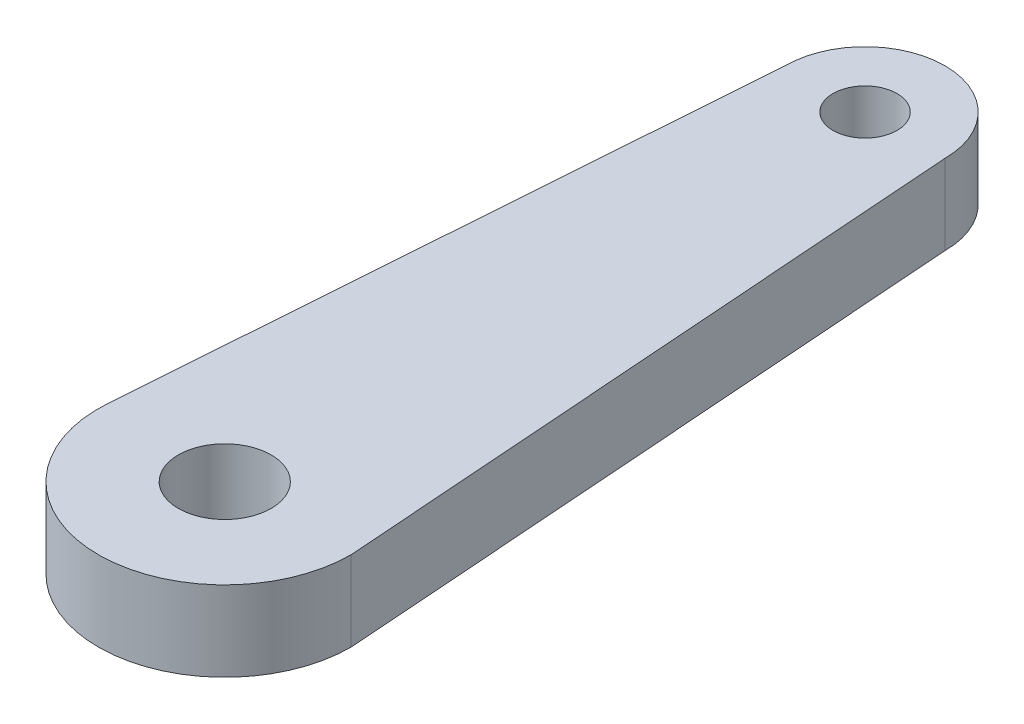
ISO-10303-21;
HEADER;
FILE_DESCRIPTION(('STEP AP214'),'2;1');
FILE_NAME('part.step','',(''),(''),'','','');
FILE_SCHEMA(('AUTOMOTIVE_DESIGN { 1 0 10303 214 1 1 1 1 }'));
ENDSEC;
DATA;
#1=APPLICATION_CONTEXT('core data for automotive mechanical design processes');
#2=APPLICATION_PROTOCOL_DEFINITION('international standard','automotive_design',2000,#1);
#3=PRODUCT_CONTEXT('',#1,'mechanical');
#4=PRODUCT('Part','Part','',(#3));
#5=PRODUCT_RELATED_PRODUCT_CATEGORY('part','',(#4));
#6=PRODUCT_DEFINITION_FORMATION('','',#4);
#7=PRODUCT_DEFINITION_CONTEXT('part definition',#1,'design');
#8=PRODUCT_DEFINITION('design','',#6,#7);
#9=PRODUCT_DEFINITION_SHAPE('','',#8);
#10=(LENGTH_UNIT() NAMED_UNIT(*) SI_UNIT(.MILLI.,.METRE.));
#11=(NAMED_UNIT(*) PLANE_ANGLE_UNIT() SI_UNIT($,.RADIAN.));
#12=(NAMED_UNIT(*) SI_UNIT($,.STERADIAN.) SOLID_ANGLE_UNIT());
#13=UNCERTAINTY_MEASURE_WITH_UNIT(LENGTH_MEASURE(1.E-05),#10,'distance_accuracy_value','');
#14=(GEOMETRIC_REPRESENTATION_CONTEXT(3) GLOBAL_UNCERTAINTY_ASSIGNED_CONTEXT((#13)) GLOBAL_UNIT_ASSIGNED_CONTEXT((#10,
#11,#12)) REPRESENTATION_CONTEXT('',''));
#15=CARTESIAN_POINT('',(0.,0.,0.));
#16=DIRECTION('',(0.,0.,1.));
#17=DIRECTION('',(1.,0.,0.));
#18=AXIS2_PLACEMENT_3D('',#15,#16,#17);
#19=CARTESIAN_POINT('',(7.85869274625251,5.,-0.569755224103307));
#20=DIRECTION('',(0.997382190387842,0.,-0.0723102088031186));
#21=DIRECTION('',(-0.0723102088031186,0.,-0.997382190387842));
#22=AXIS2_PLACEMENT_3D('',#19,#20,#21);
#23=PLANE('',#22);
#24=DIRECTION('',(0.0723102088031186,0.,0.997382190387842));
#25=VECTOR('',#24,1.);
#26=CARTESIAN_POINT('',(7.85869274625251,0.,-0.569755224103307));
#27=LINE('',#26,#25);
#28=CARTESIAN_POINT('',(5.,0.,-40.));
#29=VERTEX_POINT('',#28);
#30=CARTESIAN_POINT('',(7.9,0.,0.));
#31=VERTEX_POINT('',#30);
#32=EDGE_CURVE('E124',#29,#31,#27,.T.);
#33=ORIENTED_EDGE('',*,*,#32,.F.);
#34=DIRECTION('',(0.,-1.,0.));
#35=VECTOR('',#34,1.);
#36=CARTESIAN_POINT('',(5.,5.,-40.));
#37=LINE('',#36,#35);
#38=CARTESIAN_POINT('',(5.,5.,-40.));
#39=VERTEX_POINT('',#38);
#40=EDGE_CURVE('E11',#39,#29,#37,.T.);
#41=ORIENTED_EDGE('',*,*,#40,.F.);
#42=DIRECTION('',(0.0723102088031186,0.,0.997382190387842));
#43=VECTOR('',#42,1.);
#44=CARTESIAN_POINT('',(7.85869274625251,5.,-0.569755224103307));
#45=LINE('',#44,#43);
#46=CARTESIAN_POINT('',(7.9,5.,0.));
#47=VERTEX_POINT('',#46);
#48=EDGE_CURVE('E97',#39,#47,#45,.T.);
#49=ORIENTED_EDGE('',*,*,#48,.T.);
#50=DIRECTION('',(0.,-1.,0.));
#51=VECTOR('',#50,1.);
#52=CARTESIAN_POINT('',(7.9,5.,0.));
#53=LINE('',#52,#51);
#54=EDGE_CURVE('E87',#47,#31,#53,.T.);
#55=ORIENTED_EDGE('',*,*,#54,.T.);
#56=EDGE_LOOP('',(#33,#41,#49,#55));
#57=FACE_BOUND('',#56,.T.);
#58=ADVANCED_FACE('F47',(#57),#23,.T.);
#59=CARTESIAN_POINT('',(0.,5.,-40.));
#60=DIRECTION('',(0.,-1.,0.));
#61=DIRECTION('',(0.,0.,-1.));
#62=AXIS2_PLACEMENT_3D('',#59,#60,#61);
#63=CYLINDRICAL_SURFACE('',#62,5.);
#64=CARTESIAN_POINT('',(0.,0.,-40.));
#65=DIRECTION('',(0.,1.,0.));
#66=DIRECTION('',(0.,0.,1.));
#67=AXIS2_PLACEMENT_3D('',#64,#65,#66);
#68=CIRCLE('',#67,5.);
#69=CARTESIAN_POINT('',(-5.,0.,-40.));
#70=VERTEX_POINT('',#69);
#71=EDGE_CURVE('E104',#29,#70,#68,.T.);
#72=ORIENTED_EDGE('',*,*,#71,.T.);
#73=DIRECTION('',(0.,-1.,0.));
#74=VECTOR('',#73,1.);
#75=CARTESIAN_POINT('',(-5.,5.,-40.));
#76=LINE('',#75,#74);
#77=CARTESIAN_POINT('',(-5.,5.,-40.));
#78=VERTEX_POINT('',#77);
#79=EDGE_CURVE('E57',#78,#70,#76,.T.);
#80=ORIENTED_EDGE('',*,*,#79,.F.);
#81=CARTESIAN_POINT('',(0.,5.,-40.));
#82=DIRECTION('',(0.,1.,0.));
#83=DIRECTION('',(0.,0.,1.));
#84=AXIS2_PLACEMENT_3D('',#81,#82,#83);
#85=CIRCLE('',#84,5.);
#86=EDGE_CURVE('E92',#39,#78,#85,.T.);
#87=ORIENTED_EDGE('',*,*,#86,.F.);
#88=ORIENTED_EDGE('',*,*,#40,.T.);
#89=EDGE_LOOP('',(#72,#80,#87,#88));
#90=FACE_BOUND('',#89,.T.);
#91=ADVANCED_FACE('F102',(#90),#63,.T.);
#92=CARTESIAN_POINT('',(-7.8790193804256,5.,-0.5753725774468));
#93=DIRECTION('',(-0.997344225370329,0.,-0.0728319718287088));
#94=DIRECTION('',(-0.0728319718287088,0.,0.997344225370329));
#95=AXIS2_PLACEMENT_3D('',#92,#93,#94);
#96=PLANE('',#95);
#97=DIRECTION('',(0.0728319718287088,0.,-0.997344225370329));
#98=VECTOR('',#97,1.);
#99=CARTESIAN_POINT('',(-7.8790193804256,0.,-0.5753725774468));
#100=LINE('',#99,#98);
#101=CARTESIAN_POINT('',(-7.8790193804256,0.,-0.5753725774468));
#102=VERTEX_POINT('',#101);
#103=EDGE_CURVE('E130',#102,#70,#100,.T.);
#104=ORIENTED_EDGE('',*,*,#103,.F.);
#105=DIRECTION('',(0.,-1.,0.));
#106=VECTOR('',#105,1.);
#107=CARTESIAN_POINT('',(-7.8790193804256,5.,-0.5753725774468));
#108=LINE('',#107,#106);
#109=CARTESIAN_POINT('',(-7.8790193804256,5.,-0.5753725774468));
#110=VERTEX_POINT('',#109);
#111=EDGE_CURVE('E80',#110,#102,#108,.T.);
#112=ORIENTED_EDGE('',*,*,#111,.F.);
#113=DIRECTION('',(0.0728319718287088,0.,-0.997344225370329));
#114=VECTOR('',#113,1.);
#115=CARTESIAN_POINT('',(-7.8790193804256,5.,-0.5753725774468));
#116=LINE('',#115,#114);
#117=EDGE_CURVE('E96',#110,#78,#116,.T.);
#118=ORIENTED_EDGE('',*,*,#117,.T.);
#119=ORIENTED_EDGE('',*,*,#79,.T.);
#120=EDGE_LOOP('',(#104,#112,#118,#119));
#121=FACE_BOUND('',#120,.T.);
#122=ADVANCED_FACE('F109',(#121),#96,.T.);
#123=CARTESIAN_POINT('',(0.,5.,0.));
#124=DIRECTION('',(0.,-1.,0.));
#125=DIRECTION('',(0.,0.,-1.));
#126=AXIS2_PLACEMENT_3D('',#123,#124,#125);
#127=CYLINDRICAL_SURFACE('',#126,2.9);
#128=CARTESIAN_POINT('',(0.,5.,0.));
#129=DIRECTION('',(0.,1.,0.));
#130=DIRECTION('',(0.,0.,1.));
#131=AXIS2_PLACEMENT_3D('',#128,#129,#130);
#132=CIRCLE('',#131,2.9);
#133=CARTESIAN_POINT('',(0.,5.,2.9));
#134=VERTEX_POINT('',#133);
#135=EDGE_CURVE('E142',#134,#134,#132,.T.);
#136=ORIENTED_EDGE('',*,*,#135,.T.);
#137=EDGE_LOOP('',(#136));
#138=FACE_BOUND('',#137,.T.);
#139=CARTESIAN_POINT('',(0.,0.,0.));
#140=DIRECTION('',(0.,1.,0.));
#141=DIRECTION('',(0.,0.,1.));
#142=AXIS2_PLACEMENT_3D('',#139,#140,#141);
#143=CIRCLE('',#142,2.9);
#144=CARTESIAN_POINT('',(0.,0.,2.9));
#145=VERTEX_POINT('',#144);
#146=EDGE_CURVE('E120',#145,#145,#143,.T.);
#147=ORIENTED_EDGE('',*,*,#146,.F.);
#148=EDGE_LOOP('',(#147));
#149=FACE_BOUND('',#148,.T.);
#150=ADVANCED_FACE('F157',(#138,#149),#127,.F.);
#151=CARTESIAN_POINT('',(0.,5.,-40.));
#152=DIRECTION('',(0.,-1.,0.));
#153=DIRECTION('',(0.,0.,-1.));
#154=AXIS2_PLACEMENT_3D('',#151,#152,#153);
#155=CYLINDRICAL_SURFACE('',#154,2.);
#156=CARTESIAN_POINT('',(0.,5.,-40.));
#157=DIRECTION('',(0.,1.,0.));
#158=DIRECTION('',(0.,0.,1.));
#159=AXIS2_PLACEMENT_3D('',#156,#157,#158);
#160=CIRCLE('',#159,2.);
#161=CARTESIAN_POINT('',(0.,5.,-38.));
#162=VERTEX_POINT('',#161);
#163=EDGE_CURVE('E136',#162,#162,#160,.T.);
#164=ORIENTED_EDGE('',*,*,#163,.T.);
#165=EDGE_LOOP('',(#164));
#166=FACE_BOUND('',#165,.T.);
#167=CARTESIAN_POINT('',(0.,0.,-40.));
#168=DIRECTION('',(0.,1.,0.));
#169=DIRECTION('',(0.,0.,1.));
#170=AXIS2_PLACEMENT_3D('',#167,#168,#169);
#171=CIRCLE('',#170,2.);
#172=CARTESIAN_POINT('',(0.,0.,-38.));
#173=VERTEX_POINT('',#172);
#174=EDGE_CURVE('E116',#173,#173,#171,.T.);
#175=ORIENTED_EDGE('',*,*,#174,.F.);
#176=EDGE_LOOP('',(#175));
#177=FACE_BOUND('',#176,.T.);
#178=ADVANCED_FACE('F49',(#166,#177),#155,.F.);
#179=CARTESIAN_POINT('',(0.,5.,0.));
#180=DIRECTION('',(0.,-1.,0.));
#181=DIRECTION('',(0.,0.,-1.));
#182=AXIS2_PLACEMENT_3D('',#179,#180,#181);
#183=CYLINDRICAL_SURFACE('',#182,7.9);
#184=CARTESIAN_POINT('',(0.,0.,0.));
#185=DIRECTION('',(0.,1.,0.));
#186=DIRECTION('',(0.,0.,1.));
#187=AXIS2_PLACEMENT_3D('',#184,#185,#186);
#188=CIRCLE('',#187,7.9);
#189=EDGE_CURVE('E133',#102,#31,#188,.T.);
#190=ORIENTED_EDGE('',*,*,#189,.T.);
#191=ORIENTED_EDGE('',*,*,#54,.F.);
#192=CARTESIAN_POINT('',(0.,5.,0.));
#193=DIRECTION('',(0.,1.,0.));
#194=DIRECTION('',(0.,0.,1.));
#195=AXIS2_PLACEMENT_3D('',#192,#193,#194);
#196=CIRCLE('',#195,7.9);
#197=EDGE_CURVE('E65',#110,#47,#196,.T.);
#198=ORIENTED_EDGE('',*,*,#197,.F.);
#199=ORIENTED_EDGE('',*,*,#111,.T.);
#200=EDGE_LOOP('',(#190,#191,#198,#199));
#201=FACE_BOUND('',#200,.T.);
#202=ADVANCED_FACE('F164',(#201),#183,.T.);
#203=CARTESIAN_POINT('',(0.,5.,0.));
#204=DIRECTION('',(0.,1.,0.));
#205=DIRECTION('',(0.,0.,1.));
#206=AXIS2_PLACEMENT_3D('',#203,#204,#205);
#207=PLANE('',#206);
#208=ORIENTED_EDGE('',*,*,#163,.F.);
#209=EDGE_LOOP('',(#208));
#210=FACE_BOUND('',#209,.T.);
#211=ORIENTED_EDGE('',*,*,#135,.F.);
#212=EDGE_LOOP('',(#211));
#213=FACE_BOUND('',#212,.T.);
#214=ORIENTED_EDGE('',*,*,#48,.F.);
#215=ORIENTED_EDGE('',*,*,#86,.T.);
#216=ORIENTED_EDGE('',*,*,#117,.F.);
#217=ORIENTED_EDGE('',*,*,#197,.T.);
#218=EDGE_LOOP('',(#214,#215,#216,#217));
#219=FACE_BOUND('',#218,.T.);
#220=ADVANCED_FACE('F94',(#210,#213,#219),#207,.T.);
#221=CARTESIAN_POINT('',(0.,0.,0.));
#222=DIRECTION('',(0.,1.,0.));
#223=DIRECTION('',(0.,0.,1.));
#224=AXIS2_PLACEMENT_3D('',#221,#222,#223);
#225=PLANE('',#224);
#226=ORIENTED_EDGE('',*,*,#174,.T.);
#227=EDGE_LOOP('',(#226));
#228=FACE_BOUND('',#227,.T.);
#229=ORIENTED_EDGE('',*,*,#146,.T.);
#230=EDGE_LOOP('',(#229));
#231=FACE_BOUND('',#230,.T.);
#232=ORIENTED_EDGE('',*,*,#32,.T.);
#233=ORIENTED_EDGE('',*,*,#189,.F.);
#234=ORIENTED_EDGE('',*,*,#103,.T.);
#235=ORIENTED_EDGE('',*,*,#71,.F.);
#236=EDGE_LOOP('',(#232,#233,#234,#235));
#237=FACE_BOUND('',#236,.T.);
#238=ADVANCED_FACE('F169',(#228,#231,#237),#225,.F.);
#239=CLOSED_SHELL('',(#58,#91,#122,#150,#178,#202,#220,#238));
#240=MANIFOLD_SOLID_BREP('B2',#239);
#241=ADVANCED_BREP_SHAPE_REPRESENTATION('',(#18,#240),#14);
#242=SHAPE_DEFINITION_REPRESENTATION(#9,#241);
ENDSEC;
END-ISO-10303-21;
